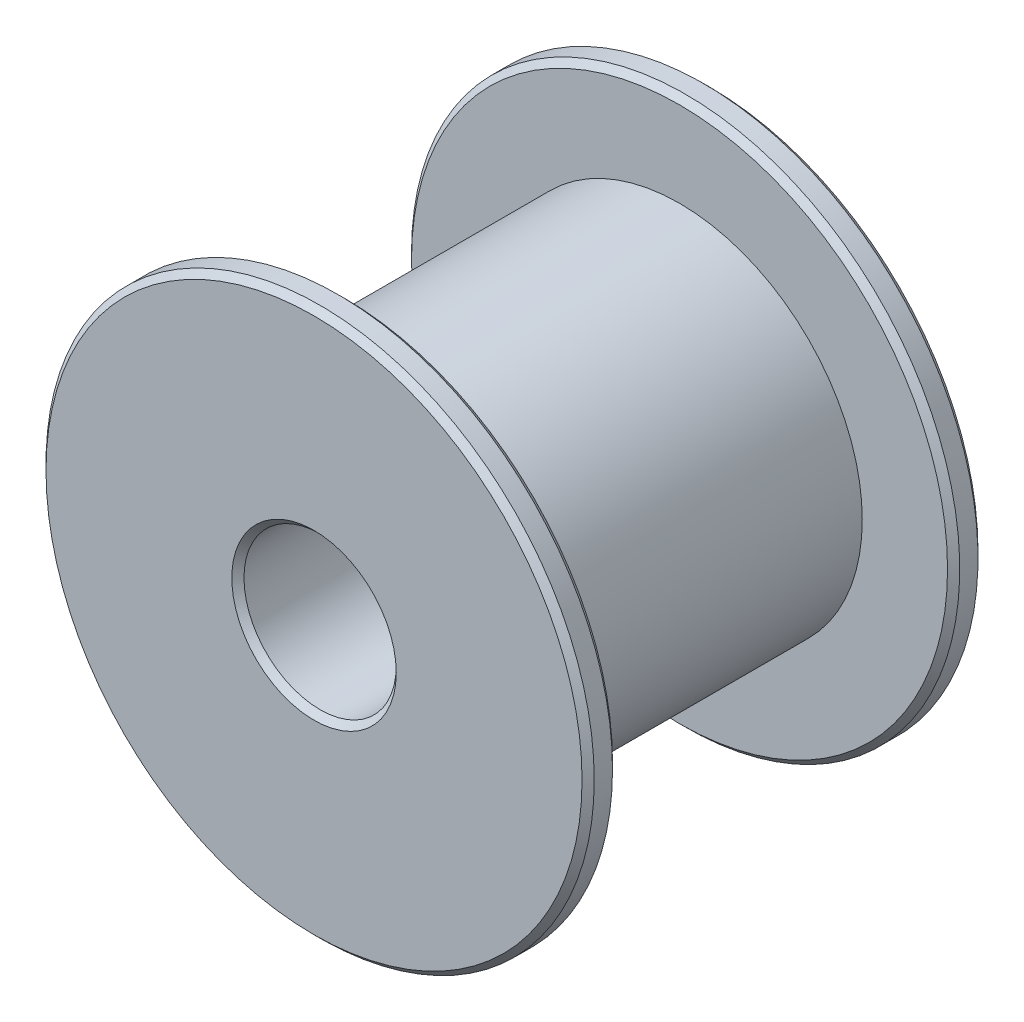
ISO-10303-21;
HEADER;
FILE_DESCRIPTION(('STEP AP214'),'2;1');
FILE_NAME('part.step','',(''),(''),'','','');
FILE_SCHEMA(('AUTOMOTIVE_DESIGN { 1 0 10303 214 1 1 1 1 }'));
ENDSEC;
DATA;
#1=APPLICATION_CONTEXT('core data for automotive mechanical design processes');
#2=APPLICATION_PROTOCOL_DEFINITION('international standard','automotive_design',2000,#1);
#3=PRODUCT_CONTEXT('',#1,'mechanical');
#4=PRODUCT('Part','Part','',(#3));
#5=PRODUCT_RELATED_PRODUCT_CATEGORY('part','',(#4));
#6=PRODUCT_DEFINITION_FORMATION('','',#4);
#7=PRODUCT_DEFINITION_CONTEXT('part definition',#1,'design');
#8=PRODUCT_DEFINITION('design','',#6,#7);
#9=PRODUCT_DEFINITION_SHAPE('','',#8);
#10=(LENGTH_UNIT() NAMED_UNIT(*) SI_UNIT(.MILLI.,.METRE.));
#11=(NAMED_UNIT(*) PLANE_ANGLE_UNIT() SI_UNIT($,.RADIAN.));
#12=(NAMED_UNIT(*) SI_UNIT($,.STERADIAN.) SOLID_ANGLE_UNIT());
#13=UNCERTAINTY_MEASURE_WITH_UNIT(LENGTH_MEASURE(1.E-05),#10,'distance_accuracy_value','');
#14=(GEOMETRIC_REPRESENTATION_CONTEXT(3) GLOBAL_UNCERTAINTY_ASSIGNED_CONTEXT((#13)) GLOBAL_UNIT_ASSIGNED_CONTEXT((#10,
#11,#12)) REPRESENTATION_CONTEXT('',''));
#15=CARTESIAN_POINT('',(0.,0.,0.));
#16=DIRECTION('',(0.,0.,1.));
#17=DIRECTION('',(1.,0.,0.));
#18=AXIS2_PLACEMENT_3D('',#15,#16,#17);
#19=CARTESIAN_POINT('',(0.,0.,5.5));
#20=DIRECTION('',(0.,0.,-1.));
#21=DIRECTION('',(-1.,0.,0.));
#22=AXIS2_PLACEMENT_3D('',#19,#20,#21);
#23=CYLINDRICAL_SURFACE('',#22,6.);
#24=CARTESIAN_POINT('',(0.,0.,5.5));
#25=DIRECTION('',(0.,0.,1.));
#26=DIRECTION('',(1.,0.,0.));
#27=AXIS2_PLACEMENT_3D('',#24,#25,#26);
#28=CIRCLE('',#27,6.);
#29=CARTESIAN_POINT('',(6.,0.,5.5));
#30=VERTEX_POINT('',#29);
#31=EDGE_CURVE('E93',#30,#30,#28,.T.);
#32=ORIENTED_EDGE('',*,*,#31,.F.);
#33=EDGE_LOOP('',(#32));
#34=FACE_BOUND('',#33,.T.);
#35=CARTESIAN_POINT('',(0.,0.,-5.5));
#36=DIRECTION('',(0.,0.,1.));
#37=DIRECTION('',(1.,0.,0.));
#38=AXIS2_PLACEMENT_3D('',#35,#36,#37);
#39=CIRCLE('',#38,6.);
#40=CARTESIAN_POINT('',(6.,0.,-5.5));
#41=VERTEX_POINT('',#40);
#42=EDGE_CURVE('E94',#41,#41,#39,.T.);
#43=ORIENTED_EDGE('',*,*,#42,.T.);
#44=EDGE_LOOP('',(#43));
#45=FACE_BOUND('',#44,.T.);
#46=ADVANCED_FACE('F36',(#34,#45),#23,.T.);
#47=CARTESIAN_POINT('',(0.,0.,6.5));
#48=DIRECTION('',(0.,0.,-1.));
#49=DIRECTION('',(-1.,0.,0.));
#50=AXIS2_PLACEMENT_3D('',#47,#48,#49);
#51=CYLINDRICAL_SURFACE('',#50,9.);
#52=CARTESIAN_POINT('',(0.,0.,6.3));
#53=DIRECTION('',(0.,0.,1.));
#54=DIRECTION('',(1.,0.,0.));
#55=AXIS2_PLACEMENT_3D('',#52,#53,#54);
#56=CIRCLE('',#55,9.);
#57=CARTESIAN_POINT('',(9.,0.,6.3));
#58=VERTEX_POINT('',#57);
#59=EDGE_CURVE('E63',#58,#58,#56,.F.);
#60=ORIENTED_EDGE('',*,*,#59,.T.);
#61=EDGE_LOOP('',(#60));
#62=FACE_BOUND('',#61,.T.);
#63=CARTESIAN_POINT('',(0.,0.,5.7));
#64=DIRECTION('',(0.,0.,1.));
#65=DIRECTION('',(1.,0.,0.));
#66=AXIS2_PLACEMENT_3D('',#63,#64,#65);
#67=CIRCLE('',#66,9.);
#68=CARTESIAN_POINT('',(9.,0.,5.7));
#69=VERTEX_POINT('',#68);
#70=EDGE_CURVE('E67',#69,#69,#67,.T.);
#71=ORIENTED_EDGE('',*,*,#70,.T.);
#72=EDGE_LOOP('',(#71));
#73=FACE_BOUND('',#72,.T.);
#74=ADVANCED_FACE('F105',(#62,#73),#51,.T.);
#75=CARTESIAN_POINT('',(0.,0.,6.5));
#76=DIRECTION('',(0.,0.,1.));
#77=DIRECTION('',(1.,0.,0.));
#78=AXIS2_PLACEMENT_3D('',#75,#76,#77);
#79=PLANE('',#78);
#80=CARTESIAN_POINT('',(0.,0.,6.5));
#81=DIRECTION('',(0.,0.,1.));
#82=DIRECTION('',(1.,0.,0.));
#83=AXIS2_PLACEMENT_3D('',#80,#81,#82);
#84=CIRCLE('',#83,2.69999999999999);
#85=CARTESIAN_POINT('',(2.69999999999999,0.,6.5));
#86=VERTEX_POINT('',#85);
#87=EDGE_CURVE('E71',#86,#86,#84,.F.);
#88=ORIENTED_EDGE('',*,*,#87,.T.);
#89=EDGE_LOOP('',(#88));
#90=FACE_BOUND('',#89,.T.);
#91=CARTESIAN_POINT('',(0.,0.,6.5));
#92=DIRECTION('',(0.,0.,1.));
#93=DIRECTION('',(1.,0.,0.));
#94=AXIS2_PLACEMENT_3D('',#91,#92,#93);
#95=CIRCLE('',#94,8.8);
#96=CARTESIAN_POINT('',(8.8,0.,6.5));
#97=VERTEX_POINT('',#96);
#98=EDGE_CURVE('E75',#97,#97,#95,.T.);
#99=ORIENTED_EDGE('',*,*,#98,.T.);
#100=EDGE_LOOP('',(#99));
#101=FACE_BOUND('',#100,.T.);
#102=ADVANCED_FACE('F128',(#90,#101),#79,.T.);
#103=CARTESIAN_POINT('',(0.,0.,5.5));
#104=DIRECTION('',(0.,0.,1.));
#105=DIRECTION('',(1.,0.,0.));
#106=AXIS2_PLACEMENT_3D('',#103,#104,#105);
#107=PLANE('',#106);
#108=CARTESIAN_POINT('',(0.,0.,5.5));
#109=DIRECTION('',(0.,0.,1.));
#110=DIRECTION('',(1.,0.,0.));
#111=AXIS2_PLACEMENT_3D('',#108,#109,#110);
#112=CIRCLE('',#111,8.8);
#113=CARTESIAN_POINT('',(8.8,0.,5.5));
#114=VERTEX_POINT('',#113);
#115=EDGE_CURVE('E57',#114,#114,#112,.F.);
#116=ORIENTED_EDGE('',*,*,#115,.T.);
#117=EDGE_LOOP('',(#116));
#118=FACE_BOUND('',#117,.T.);
#119=ORIENTED_EDGE('',*,*,#31,.T.);
#120=EDGE_LOOP('',(#119));
#121=FACE_BOUND('',#120,.T.);
#122=ADVANCED_FACE('F101',(#118,#121),#107,.F.);
#123=CARTESIAN_POINT('',(0.,0.,-6.5));
#124=DIRECTION('',(0.,0.,1.));
#125=DIRECTION('',(1.,0.,0.));
#126=AXIS2_PLACEMENT_3D('',#123,#124,#125);
#127=CYLINDRICAL_SURFACE('',#126,9.);
#128=CARTESIAN_POINT('',(0.,0.,-5.7));
#129=DIRECTION('',(0.,0.,-1.));
#130=DIRECTION('',(-1.,0.,0.));
#131=AXIS2_PLACEMENT_3D('',#128,#129,#130);
#132=CIRCLE('',#131,9.);
#133=CARTESIAN_POINT('',(-9.,0.,-5.7));
#134=VERTEX_POINT('',#133);
#135=EDGE_CURVE('E10',#134,#134,#132,.T.);
#136=ORIENTED_EDGE('',*,*,#135,.T.);
#137=EDGE_LOOP('',(#136));
#138=FACE_BOUND('',#137,.T.);
#139=CARTESIAN_POINT('',(0.,0.,-6.3));
#140=DIRECTION('',(0.,0.,-1.));
#141=DIRECTION('',(-1.,0.,0.));
#142=AXIS2_PLACEMENT_3D('',#139,#140,#141);
#143=CIRCLE('',#142,9.);
#144=CARTESIAN_POINT('',(-9.,0.,-6.3));
#145=VERTEX_POINT('',#144);
#146=EDGE_CURVE('E45',#145,#145,#143,.F.);
#147=ORIENTED_EDGE('',*,*,#146,.T.);
#148=EDGE_LOOP('',(#147));
#149=FACE_BOUND('',#148,.T.);
#150=ADVANCED_FACE('F122',(#138,#149),#127,.T.);
#151=CARTESIAN_POINT('',(0.,0.,-6.5));
#152=DIRECTION('',(0.,0.,-1.));
#153=DIRECTION('',(1.,0.,0.));
#154=AXIS2_PLACEMENT_3D('',#151,#152,#153);
#155=PLANE('',#154);
#156=CARTESIAN_POINT('',(0.,0.,-6.5));
#157=DIRECTION('',(0.,0.,-1.));
#158=DIRECTION('',(-1.,0.,0.));
#159=AXIS2_PLACEMENT_3D('',#156,#157,#158);
#160=CIRCLE('',#159,2.70000000000003);
#161=CARTESIAN_POINT('',(-2.70000000000003,0.,-6.5));
#162=VERTEX_POINT('',#161);
#163=EDGE_CURVE('E79',#162,#162,#160,.F.);
#164=ORIENTED_EDGE('',*,*,#163,.T.);
#165=EDGE_LOOP('',(#164));
#166=FACE_BOUND('',#165,.T.);
#167=CARTESIAN_POINT('',(0.,0.,-6.5));
#168=DIRECTION('',(0.,0.,-1.));
#169=DIRECTION('',(-1.,0.,0.));
#170=AXIS2_PLACEMENT_3D('',#167,#168,#169);
#171=CIRCLE('',#170,8.8);
#172=CARTESIAN_POINT('',(-8.8,0.,-6.5));
#173=VERTEX_POINT('',#172);
#174=EDGE_CURVE('E83',#173,#173,#171,.T.);
#175=ORIENTED_EDGE('',*,*,#174,.T.);
#176=EDGE_LOOP('',(#175));
#177=FACE_BOUND('',#176,.T.);
#178=ADVANCED_FACE('F112',(#166,#177),#155,.T.);
#179=CARTESIAN_POINT('',(0.,0.,-5.5));
#180=DIRECTION('',(0.,0.,-1.));
#181=DIRECTION('',(1.,0.,0.));
#182=AXIS2_PLACEMENT_3D('',#179,#180,#181);
#183=PLANE('',#182);
#184=CARTESIAN_POINT('',(0.,0.,-5.5));
#185=DIRECTION('',(0.,0.,-1.));
#186=DIRECTION('',(-1.,0.,0.));
#187=AXIS2_PLACEMENT_3D('',#184,#185,#186);
#188=CIRCLE('',#187,8.8);
#189=CARTESIAN_POINT('',(-8.8,0.,-5.5));
#190=VERTEX_POINT('',#189);
#191=EDGE_CURVE('E52',#190,#190,#188,.F.);
#192=ORIENTED_EDGE('',*,*,#191,.T.);
#193=EDGE_LOOP('',(#192));
#194=FACE_BOUND('',#193,.T.);
#195=ORIENTED_EDGE('',*,*,#42,.F.);
#196=EDGE_LOOP('',(#195));
#197=FACE_BOUND('',#196,.T.);
#198=ADVANCED_FACE('F109',(#194,#197),#183,.F.);
#199=CARTESIAN_POINT('',(0.,0.,6.5));
#200=DIRECTION('',(0.,0.,-1.));
#201=DIRECTION('',(-1.,0.,0.));
#202=AXIS2_PLACEMENT_3D('',#199,#200,#201);
#203=CYLINDRICAL_SURFACE('',#202,2.5);
#204=CARTESIAN_POINT('',(0.,0.,-6.29999999999997));
#205=DIRECTION('',(0.,0.,-1.));
#206=DIRECTION('',(-1.,0.,0.));
#207=AXIS2_PLACEMENT_3D('',#204,#205,#206);
#208=CIRCLE('',#207,2.5);
#209=CARTESIAN_POINT('',(-2.5,0.,-6.29999999999997));
#210=VERTEX_POINT('',#209);
#211=EDGE_CURVE('E86',#210,#210,#208,.T.);
#212=CARTESIAN_POINT('',(0.,0.,6.30000000000001));
#213=DIRECTION('',(0.,0.,1.));
#214=DIRECTION('',(1.,0.,0.));
#215=AXIS2_PLACEMENT_3D('',#212,#213,#214);
#216=CIRCLE('',#215,2.5);
#217=CARTESIAN_POINT('',(-2.5,0.,6.30000000000001));
#218=VERTEX_POINT('',#217);
#219=EDGE_CURVE('E90',#218,#218,#216,.T.);
#220=CARTESIAN_POINT('',(-2.5,0.,-6.29999999999997));
#221=CARTESIAN_POINT('',(-2.5,0.,-6.16874999999997));
#222=CARTESIAN_POINT('',(-2.5,0.,-6.03749999999997));
#223=CARTESIAN_POINT('',(-2.5,0.,-5.77499999999997));
#224=CARTESIAN_POINT('',(-2.5,0.,-5.64374999999997));
#225=CARTESIAN_POINT('',(-2.5,0.,-5.38124999999997));
#226=CARTESIAN_POINT('',(-2.5,0.,-5.24999999999997));
#227=CARTESIAN_POINT('',(-2.5,0.,-4.98749999999997));
#228=CARTESIAN_POINT('',(-2.5,0.,-4.85624999999998));
#229=CARTESIAN_POINT('',(-2.5,0.,-4.59374999999997));
#230=CARTESIAN_POINT('',(-2.5,0.,-4.46249999999998));
#231=CARTESIAN_POINT('',(-2.5,0.,-4.19999999999997));
#232=CARTESIAN_POINT('',(-2.5,0.,-4.06874999999997));
#233=CARTESIAN_POINT('',(-2.5,0.,-3.80624999999998));
#234=CARTESIAN_POINT('',(-2.5,0.,-3.67499999999997));
#235=CARTESIAN_POINT('',(-2.5,0.,-3.41249999999998));
#236=CARTESIAN_POINT('',(-2.5,0.,-3.28124999999998));
#237=CARTESIAN_POINT('',(-2.5,0.,-3.01874999999998));
#238=CARTESIAN_POINT('',(-2.5,0.,-2.88749999999998));
#239=CARTESIAN_POINT('',(-2.5,0.,-2.62499999999998));
#240=CARTESIAN_POINT('',(-2.5,0.,-2.49374999999998));
#241=CARTESIAN_POINT('',(-2.5,0.,-2.23124999999998));
#242=CARTESIAN_POINT('',(-2.5,0.,-2.09999999999998));
#243=CARTESIAN_POINT('',(-2.5,0.,-1.83749999999998));
#244=CARTESIAN_POINT('',(-2.5,0.,-1.70624999999998));
#245=CARTESIAN_POINT('',(-2.5,0.,-1.44374999999998));
#246=CARTESIAN_POINT('',(-2.5,0.,-1.31249999999998));
#247=CARTESIAN_POINT('',(-2.5,0.,-1.04999999999998));
#248=CARTESIAN_POINT('',(-2.5,0.,-0.918749999999979));
#249=CARTESIAN_POINT('',(-2.5,0.,-0.656249999999979));
#250=CARTESIAN_POINT('',(-2.5,0.,-0.52499999999998));
#251=CARTESIAN_POINT('',(-2.5,0.,-0.26249999999998));
#252=CARTESIAN_POINT('',(-2.5,0.,-0.13124999999998));
#253=CARTESIAN_POINT('',(-2.5,0.,0.13125000000002));
#254=CARTESIAN_POINT('',(-2.5,0.,0.26250000000002));
#255=CARTESIAN_POINT('',(-2.5,0.,0.52500000000002));
#256=CARTESIAN_POINT('',(-2.5,0.,0.656250000000019));
#257=CARTESIAN_POINT('',(-2.5,0.,0.918750000000019));
#258=CARTESIAN_POINT('',(-2.5,0.,1.05000000000002));
#259=CARTESIAN_POINT('',(-2.5,0.,1.31250000000002));
#260=CARTESIAN_POINT('',(-2.5,0.,1.44375000000002));
#261=CARTESIAN_POINT('',(-2.5,0.,1.70625000000002));
#262=CARTESIAN_POINT('',(-2.5,0.,1.83750000000002));
#263=CARTESIAN_POINT('',(-2.5,0.,2.10000000000002));
#264=CARTESIAN_POINT('',(-2.5,0.,2.23125000000002));
#265=CARTESIAN_POINT('',(-2.5,0.,2.49375000000002));
#266=CARTESIAN_POINT('',(-2.5,0.,2.62500000000002));
#267=CARTESIAN_POINT('',(-2.5,0.,2.88750000000002));
#268=CARTESIAN_POINT('',(-2.5,0.,3.01875000000002));
#269=CARTESIAN_POINT('',(-2.5,0.,3.28125000000002));
#270=CARTESIAN_POINT('',(-2.5,0.,3.41250000000002));
#271=CARTESIAN_POINT('',(-2.5,0.,3.67500000000002));
#272=CARTESIAN_POINT('',(-2.5,0.,3.80625000000002));
#273=CARTESIAN_POINT('',(-2.5,0.,4.06875000000002));
#274=CARTESIAN_POINT('',(-2.5,0.,4.20000000000002));
#275=CARTESIAN_POINT('',(-2.5,0.,4.46250000000002));
#276=CARTESIAN_POINT('',(-2.5,0.,4.59375000000002));
#277=CARTESIAN_POINT('',(-2.5,0.,4.85625000000002));
#278=CARTESIAN_POINT('',(-2.5,0.,4.98750000000001));
#279=CARTESIAN_POINT('',(-2.5,0.,5.25000000000001));
#280=CARTESIAN_POINT('',(-2.5,0.,5.38125000000001));
#281=CARTESIAN_POINT('',(-2.5,0.,5.64375000000001));
#282=CARTESIAN_POINT('',(-2.5,0.,5.77500000000001));
#283=CARTESIAN_POINT('',(-2.5,0.,6.03750000000001));
#284=CARTESIAN_POINT('',(-2.5,0.,6.16875000000001));
#285=CARTESIAN_POINT('',(-2.5,0.,6.30000000000001));
#286=B_SPLINE_CURVE_WITH_KNOTS('',3,(#220,#221,#222,#223,#224,#225,#226,#227,#228,#229,#230,
#231,#232,#233,#234,#235,#236,#237,#238,#239,#240,#241,#242,#243,#244,#245,#246,#247,#248,#249,
#250,#251,#252,#253,#254,#255,#256,#257,#258,#259,#260,#261,#262,#263,#264,#265,#266,#267,#268,
#269,#270,#271,#272,#273,#274,#275,#276,#277,#278,#279,#280,#281,#282,#283,#284,#285),
.UNSPECIFIED.,.F.,.F.,(4,2,2,2,2,2,2,2,2,2,2,2,2,2,2,2,2,2,2,2,2,2,2,2,2,2,2,2,2,2,2,2,4),(0.,
0.39375,0.7875,1.18125,1.575,1.96875,2.3625,2.75625,3.15,3.54375,3.9375,4.33124999999999,4.725,
5.11874999999999,5.51249999999999,5.90624999999999,6.29999999999999,6.69374999999999,
7.08749999999999,7.48124999999999,7.87499999999999,8.26874999999999,8.66249999999999,
9.05624999999999,9.44999999999999,9.84374999999999,10.2375,10.63125,11.025,11.41875,11.8125,
12.20625,12.6),.UNSPECIFIED.);
#287=EDGE_CURVE('BSEAM111',#210,#218,#286,.T.);
#288=ORIENTED_EDGE('',*,*,#211,.T.);
#289=ORIENTED_EDGE('',*,*,#219,.T.);
#290=ORIENTED_EDGE('',*,*,#287,.T.);
#291=ORIENTED_EDGE('',*,*,#287,.F.);
#292=EDGE_LOOP('',(#288,#290,#289,#291));
#293=FACE_BOUND('',#292,.T.);
#294=ADVANCED_FACE('F111',(#293),#203,.F.);
#295=CARTESIAN_POINT('',(0.,0.,-6.29999999999997));
#296=DIRECTION('',(0.,0.,-1.));
#297=DIRECTION('',(-1.,0.,0.));
#298=AXIS2_PLACEMENT_3D('',#295,#296,#297);
#299=CONICAL_SURFACE('',#298,2.5,0.785398163397448);
#300=ORIENTED_EDGE('',*,*,#163,.F.);
#301=EDGE_LOOP('',(#300));
#302=FACE_BOUND('',#301,.T.);
#303=ORIENTED_EDGE('',*,*,#211,.F.);
#304=EDGE_LOOP('',(#303));
#305=FACE_BOUND('',#304,.T.);
#306=ADVANCED_FACE('F119',(#302,#305),#299,.F.);
#307=CARTESIAN_POINT('',(0.,0.,6.5));
#308=DIRECTION('',(0.,0.,1.));
#309=DIRECTION('',(1.,0.,0.));
#310=AXIS2_PLACEMENT_3D('',#307,#308,#309);
#311=CONICAL_SURFACE('',#310,2.69999999999999,0.785398163397448);
#312=ORIENTED_EDGE('',*,*,#219,.F.);
#313=EDGE_LOOP('',(#312));
#314=FACE_BOUND('',#313,.T.);
#315=ORIENTED_EDGE('',*,*,#87,.F.);
#316=EDGE_LOOP('',(#315));
#317=FACE_BOUND('',#316,.T.);
#318=ADVANCED_FACE('F144',(#314,#317),#311,.F.);
#319=CARTESIAN_POINT('',(0.,0.,6.5));
#320=DIRECTION('',(0.,0.,-1.));
#321=DIRECTION('',(-1.,0.,0.));
#322=AXIS2_PLACEMENT_3D('',#319,#320,#321);
#323=CONICAL_SURFACE('',#322,8.8,0.785398163397448);
#324=ORIENTED_EDGE('',*,*,#59,.F.);
#325=EDGE_LOOP('',(#324));
#326=FACE_BOUND('',#325,.T.);
#327=ORIENTED_EDGE('',*,*,#98,.F.);
#328=EDGE_LOOP('',(#327));
#329=FACE_BOUND('',#328,.T.);
#330=ADVANCED_FACE('F151',(#326,#329),#323,.T.);
#331=CARTESIAN_POINT('',(0.,0.,5.7));
#332=DIRECTION('',(0.,0.,1.));
#333=DIRECTION('',(1.,0.,0.));
#334=AXIS2_PLACEMENT_3D('',#331,#332,#333);
#335=CONICAL_SURFACE('',#334,9.,0.785398163397453);
#336=ORIENTED_EDGE('',*,*,#115,.F.);
#337=EDGE_LOOP('',(#336));
#338=FACE_BOUND('',#337,.T.);
#339=ORIENTED_EDGE('',*,*,#70,.F.);
#340=EDGE_LOOP('',(#339));
#341=FACE_BOUND('',#340,.T.);
#342=ADVANCED_FACE('F158',(#338,#341),#335,.T.);
#343=CARTESIAN_POINT('',(0.,0.,-5.5));
#344=DIRECTION('',(0.,0.,-1.));
#345=DIRECTION('',(-1.,0.,0.));
#346=AXIS2_PLACEMENT_3D('',#343,#344,#345);
#347=CONICAL_SURFACE('',#346,8.8,0.785398163397448);
#348=ORIENTED_EDGE('',*,*,#135,.F.);
#349=EDGE_LOOP('',(#348));
#350=FACE_BOUND('',#349,.T.);
#351=ORIENTED_EDGE('',*,*,#191,.F.);
#352=EDGE_LOOP('',(#351));
#353=FACE_BOUND('',#352,.T.);
#354=ADVANCED_FACE('F164',(#350,#353),#347,.T.);
#355=CARTESIAN_POINT('',(0.,0.,-6.3));
#356=DIRECTION('',(0.,0.,1.));
#357=DIRECTION('',(1.,0.,0.));
#358=AXIS2_PLACEMENT_3D('',#355,#356,#357);
#359=CONICAL_SURFACE('',#358,9.,0.785398163397453);
#360=ORIENTED_EDGE('',*,*,#174,.F.);
#361=EDGE_LOOP('',(#360));
#362=FACE_BOUND('',#361,.T.);
#363=ORIENTED_EDGE('',*,*,#146,.F.);
#364=EDGE_LOOP('',(#363));
#365=FACE_BOUND('',#364,.T.);
#366=ADVANCED_FACE('F39',(#362,#365),#359,.T.);
#367=CLOSED_SHELL('',(#46,#74,#102,#122,#150,#178,#198,#294,#306,#318,#330,#342,#354,#366));
#368=MANIFOLD_SOLID_BREP('B2',#367);
#369=ADVANCED_BREP_SHAPE_REPRESENTATION('',(#18,#368),#14);
#370=SHAPE_DEFINITION_REPRESENTATION(#9,#369);
ENDSEC;
END-ISO-10303-21;
